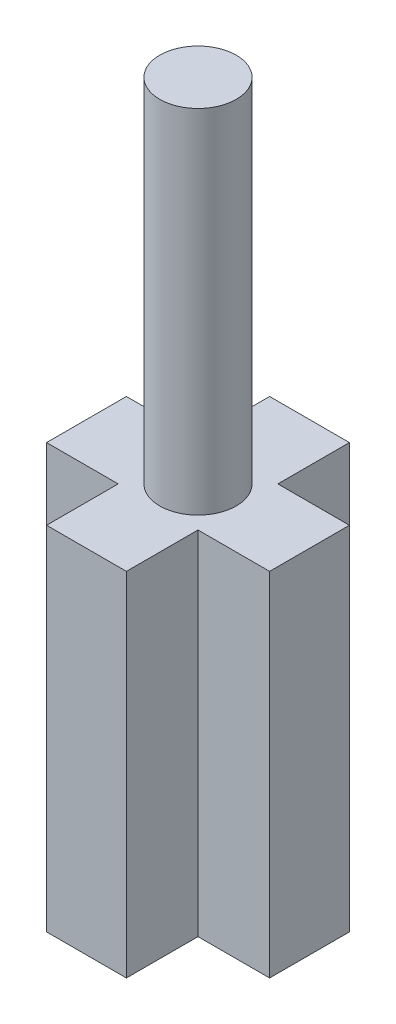
ISO-10303-21;
HEADER;
FILE_DESCRIPTION(('STEP AP214'),'2;1');
FILE_NAME('part.step','',(''),(''),'','','');
FILE_SCHEMA(('AUTOMOTIVE_DESIGN { 1 0 10303 214 1 1 1 1 }'));
ENDSEC;
DATA;
#1=APPLICATION_CONTEXT('core data for automotive mechanical design processes');
#2=APPLICATION_PROTOCOL_DEFINITION('international standard','automotive_design',2000,#1);
#3=PRODUCT_CONTEXT('',#1,'mechanical');
#4=PRODUCT('Part','Part','',(#3));
#5=PRODUCT_RELATED_PRODUCT_CATEGORY('part','',(#4));
#6=PRODUCT_DEFINITION_FORMATION('','',#4);
#7=PRODUCT_DEFINITION_CONTEXT('part definition',#1,'design');
#8=PRODUCT_DEFINITION('design','',#6,#7);
#9=PRODUCT_DEFINITION_SHAPE('','',#8);
#10=(LENGTH_UNIT() NAMED_UNIT(*) SI_UNIT(.MILLI.,.METRE.));
#11=(NAMED_UNIT(*) PLANE_ANGLE_UNIT() SI_UNIT($,.RADIAN.));
#12=(NAMED_UNIT(*) SI_UNIT($,.STERADIAN.) SOLID_ANGLE_UNIT());
#13=UNCERTAINTY_MEASURE_WITH_UNIT(LENGTH_MEASURE(1.E-05),#10,'distance_accuracy_value','');
#14=(GEOMETRIC_REPRESENTATION_CONTEXT(3) GLOBAL_UNCERTAINTY_ASSIGNED_CONTEXT((#13)) GLOBAL_UNIT_ASSIGNED_CONTEXT((#10,
#11,#12)) REPRESENTATION_CONTEXT('',''));
#15=CARTESIAN_POINT('',(0.,0.,0.));
#16=DIRECTION('',(0.,0.,1.));
#17=DIRECTION('',(1.,0.,0.));
#18=AXIS2_PLACEMENT_3D('',#15,#16,#17);
#19=CARTESIAN_POINT('',(0.863599999999994,7.62,0.863599999999999));
#20=DIRECTION('',(-1.,0.,0.));
#21=DIRECTION('',(0.,0.,1.));
#22=AXIS2_PLACEMENT_3D('',#19,#20,#21);
#23=PLANE('',#22);
#24=DIRECTION('',(0.,0.,-1.));
#25=VECTOR('',#24,1.);
#26=CARTESIAN_POINT('',(0.863599999999994,0.,0.863599999999999));
#27=LINE('',#26,#25);
#28=CARTESIAN_POINT('',(0.863599999999985,0.,2.41299999999999));
#29=VERTEX_POINT('',#28);
#30=CARTESIAN_POINT('',(0.863599999999994,0.,0.863599999999999));
#31=VERTEX_POINT('',#30);
#32=EDGE_CURVE('E161',#29,#31,#27,.T.);
#33=ORIENTED_EDGE('',*,*,#32,.T.);
#34=DIRECTION('',(0.,-1.,0.));
#35=VECTOR('',#34,1.);
#36=CARTESIAN_POINT('',(0.863599999999994,7.62,0.863599999999999));
#37=LINE('',#36,#35);
#38=CARTESIAN_POINT('',(0.863599999999994,7.62,0.863599999999999));
#39=VERTEX_POINT('',#38);
#40=EDGE_CURVE('E11',#39,#31,#37,.T.);
#41=ORIENTED_EDGE('',*,*,#40,.F.);
#42=DIRECTION('',(0.,0.,-1.));
#43=VECTOR('',#42,1.);
#44=CARTESIAN_POINT('',(0.863599999999994,7.62,0.863599999999999));
#45=LINE('',#44,#43);
#46=CARTESIAN_POINT('',(0.863599999999985,7.62,2.41299999999999));
#47=VERTEX_POINT('',#46);
#48=EDGE_CURVE('E184',#47,#39,#45,.T.);
#49=ORIENTED_EDGE('',*,*,#48,.F.);
#50=DIRECTION('',(0.,-1.,0.));
#51=VECTOR('',#50,1.);
#52=CARTESIAN_POINT('',(0.863599999999985,7.62,2.41299999999999));
#53=LINE('',#52,#51);
#54=EDGE_CURVE('E157',#47,#29,#53,.T.);
#55=ORIENTED_EDGE('',*,*,#54,.T.);
#56=EDGE_LOOP('',(#33,#41,#49,#55));
#57=FACE_BOUND('',#56,.T.);
#58=ADVANCED_FACE('F41',(#57),#23,.F.);
#59=CARTESIAN_POINT('',(0.863599999999994,7.62,0.863599999999999));
#60=DIRECTION('',(0.,0.,-1.));
#61=DIRECTION('',(-1.,0.,0.));
#62=AXIS2_PLACEMENT_3D('',#59,#60,#61);
#63=PLANE('',#62);
#64=DIRECTION('',(1.,0.,0.));
#65=VECTOR('',#64,1.);
#66=CARTESIAN_POINT('',(0.863599999999994,0.,0.863599999999999));
#67=LINE('',#66,#65);
#68=CARTESIAN_POINT('',(2.41299999999999,0.,0.863599999999998));
#69=VERTEX_POINT('',#68);
#70=EDGE_CURVE('E164',#31,#69,#67,.T.);
#71=ORIENTED_EDGE('',*,*,#70,.T.);
#72=DIRECTION('',(0.,-1.,0.));
#73=VECTOR('',#72,1.);
#74=CARTESIAN_POINT('',(2.41299999999999,7.62,0.863599999999998));
#75=LINE('',#74,#73);
#76=CARTESIAN_POINT('',(2.41299999999999,7.62,0.863599999999998));
#77=VERTEX_POINT('',#76);
#78=EDGE_CURVE('E49',#77,#69,#75,.T.);
#79=ORIENTED_EDGE('',*,*,#78,.F.);
#80=DIRECTION('',(1.,0.,0.));
#81=VECTOR('',#80,1.);
#82=CARTESIAN_POINT('',(0.863599999999994,7.62,0.863599999999999));
#83=LINE('',#82,#81);
#84=EDGE_CURVE('E112',#39,#77,#83,.T.);
#85=ORIENTED_EDGE('',*,*,#84,.F.);
#86=ORIENTED_EDGE('',*,*,#40,.T.);
#87=EDGE_LOOP('',(#71,#79,#85,#86));
#88=FACE_BOUND('',#87,.T.);
#89=ADVANCED_FACE('F263',(#88),#63,.F.);
#90=CARTESIAN_POINT('',(2.41299999999999,7.62,0.863599999999998));
#91=DIRECTION('',(-1.,0.,0.));
#92=DIRECTION('',(0.,0.,1.));
#93=AXIS2_PLACEMENT_3D('',#90,#91,#92);
#94=PLANE('',#93);
#95=DIRECTION('',(0.,0.,-1.));
#96=VECTOR('',#95,1.);
#97=CARTESIAN_POINT('',(2.41299999999999,0.,0.863599999999998));
#98=LINE('',#97,#96);
#99=CARTESIAN_POINT('',(2.41299999999999,0.,-0.863600000000002));
#100=VERTEX_POINT('',#99);
#101=EDGE_CURVE('E167',#69,#100,#98,.T.);
#102=ORIENTED_EDGE('',*,*,#101,.T.);
#103=DIRECTION('',(0.,-1.,0.));
#104=VECTOR('',#103,1.);
#105=CARTESIAN_POINT('',(2.41299999999999,7.62,-0.863600000000002));
#106=LINE('',#105,#104);
#107=CARTESIAN_POINT('',(2.41299999999999,7.62,-0.863600000000002));
#108=VERTEX_POINT('',#107);
#109=EDGE_CURVE('E203',#108,#100,#106,.T.);
#110=ORIENTED_EDGE('',*,*,#109,.F.);
#111=DIRECTION('',(0.,0.,-1.));
#112=VECTOR('',#111,1.);
#113=CARTESIAN_POINT('',(2.41299999999999,7.62,0.863599999999998));
#114=LINE('',#113,#112);
#115=EDGE_CURVE('E211',#77,#108,#114,.T.);
#116=ORIENTED_EDGE('',*,*,#115,.F.);
#117=ORIENTED_EDGE('',*,*,#78,.T.);
#118=EDGE_LOOP('',(#102,#110,#116,#117));
#119=FACE_BOUND('',#118,.T.);
#120=ADVANCED_FACE('F209',(#119),#94,.F.);
#121=CARTESIAN_POINT('',(0.863599999999994,7.62,-0.863600000000001));
#122=DIRECTION('',(0.,0.,1.));
#123=DIRECTION('',(1.,0.,0.));
#124=AXIS2_PLACEMENT_3D('',#121,#122,#123);
#125=PLANE('',#124);
#126=DIRECTION('',(-1.,0.,0.));
#127=VECTOR('',#126,1.);
#128=CARTESIAN_POINT('',(0.863599999999994,0.,-0.863600000000001));
#129=LINE('',#128,#127);
#130=CARTESIAN_POINT('',(0.863599999999994,0.,-0.863600000000001));
#131=VERTEX_POINT('',#130);
#132=EDGE_CURVE('E169',#100,#131,#129,.T.);
#133=ORIENTED_EDGE('',*,*,#132,.T.);
#134=DIRECTION('',(0.,-1.,0.));
#135=VECTOR('',#134,1.);
#136=CARTESIAN_POINT('',(0.863599999999994,7.62,-0.863600000000001));
#137=LINE('',#136,#135);
#138=CARTESIAN_POINT('',(0.863599999999994,7.62,-0.863600000000001));
#139=VERTEX_POINT('',#138);
#140=EDGE_CURVE('E200',#139,#131,#137,.T.);
#141=ORIENTED_EDGE('',*,*,#140,.F.);
#142=DIRECTION('',(-1.,0.,0.));
#143=VECTOR('',#142,1.);
#144=CARTESIAN_POINT('',(0.863599999999994,7.62,-0.863600000000001));
#145=LINE('',#144,#143);
#146=EDGE_CURVE('E229',#108,#139,#145,.T.);
#147=ORIENTED_EDGE('',*,*,#146,.F.);
#148=ORIENTED_EDGE('',*,*,#109,.T.);
#149=EDGE_LOOP('',(#133,#141,#147,#148));
#150=FACE_BOUND('',#149,.T.);
#151=ADVANCED_FACE('F220',(#150),#125,.F.);
#152=CARTESIAN_POINT('',(0.863599999999985,7.62,-2.413));
#153=DIRECTION('',(-1.,0.,0.));
#154=DIRECTION('',(0.,0.,1.));
#155=AXIS2_PLACEMENT_3D('',#152,#153,#154);
#156=PLANE('',#155);
#157=DIRECTION('',(0.,0.,-1.));
#158=VECTOR('',#157,1.);
#159=CARTESIAN_POINT('',(0.863599999999985,0.,-2.413));
#160=LINE('',#159,#158);
#161=CARTESIAN_POINT('',(0.863599999999985,0.,-2.413));
#162=VERTEX_POINT('',#161);
#163=EDGE_CURVE('E171',#131,#162,#160,.T.);
#164=ORIENTED_EDGE('',*,*,#163,.T.);
#165=DIRECTION('',(0.,-1.,0.));
#166=VECTOR('',#165,1.);
#167=CARTESIAN_POINT('',(0.863599999999985,7.62,-2.413));
#168=LINE('',#167,#166);
#169=CARTESIAN_POINT('',(0.863599999999985,7.62,-2.413));
#170=VERTEX_POINT('',#169);
#171=EDGE_CURVE('E197',#170,#162,#168,.T.);
#172=ORIENTED_EDGE('',*,*,#171,.F.);
#173=DIRECTION('',(0.,0.,-1.));
#174=VECTOR('',#173,1.);
#175=CARTESIAN_POINT('',(0.863599999999985,7.62,-2.413));
#176=LINE('',#175,#174);
#177=EDGE_CURVE('E226',#139,#170,#176,.T.);
#178=ORIENTED_EDGE('',*,*,#177,.F.);
#179=ORIENTED_EDGE('',*,*,#140,.T.);
#180=EDGE_LOOP('',(#164,#172,#178,#179));
#181=FACE_BOUND('',#180,.T.);
#182=ADVANCED_FACE('F224',(#181),#156,.F.);
#183=CARTESIAN_POINT('',(-0.863600000000019,7.62,-2.413));
#184=DIRECTION('',(0.,0.,1.));
#185=DIRECTION('',(1.,0.,0.));
#186=AXIS2_PLACEMENT_3D('',#183,#184,#185);
#187=PLANE('',#186);
#188=DIRECTION('',(-1.,0.,0.));
#189=VECTOR('',#188,1.);
#190=CARTESIAN_POINT('',(-0.863600000000019,0.,-2.413));
#191=LINE('',#190,#189);
#192=CARTESIAN_POINT('',(-0.863600000000019,0.,-2.413));
#193=VERTEX_POINT('',#192);
#194=EDGE_CURVE('E173',#162,#193,#191,.T.);
#195=ORIENTED_EDGE('',*,*,#194,.T.);
#196=DIRECTION('',(0.,-1.,0.));
#197=VECTOR('',#196,1.);
#198=CARTESIAN_POINT('',(-0.863600000000019,7.62,-2.413));
#199=LINE('',#198,#197);
#200=CARTESIAN_POINT('',(-0.863600000000019,7.62,-2.413));
#201=VERTEX_POINT('',#200);
#202=EDGE_CURVE('E194',#201,#193,#199,.T.);
#203=ORIENTED_EDGE('',*,*,#202,.F.);
#204=DIRECTION('',(-1.,0.,0.));
#205=VECTOR('',#204,1.);
#206=CARTESIAN_POINT('',(-0.863600000000019,7.62,-2.413));
#207=LINE('',#206,#205);
#208=EDGE_CURVE('E228',#170,#201,#207,.T.);
#209=ORIENTED_EDGE('',*,*,#208,.F.);
#210=ORIENTED_EDGE('',*,*,#171,.T.);
#211=EDGE_LOOP('',(#195,#203,#209,#210));
#212=FACE_BOUND('',#211,.T.);
#213=ADVANCED_FACE('F276',(#212),#187,.F.);
#214=CARTESIAN_POINT('',(-0.863600000000019,7.62,-2.413));
#215=DIRECTION('',(1.,0.,0.));
#216=DIRECTION('',(0.,0.,-1.));
#217=AXIS2_PLACEMENT_3D('',#214,#215,#216);
#218=PLANE('',#217);
#219=DIRECTION('',(0.,0.,1.));
#220=VECTOR('',#219,1.);
#221=CARTESIAN_POINT('',(-0.863600000000019,0.,-2.413));
#222=LINE('',#221,#220);
#223=CARTESIAN_POINT('',(-0.863600000000004,0.,-0.8636));
#224=VERTEX_POINT('',#223);
#225=EDGE_CURVE('E175',#193,#224,#222,.T.);
#226=ORIENTED_EDGE('',*,*,#225,.T.);
#227=DIRECTION('',(0.,-1.,0.));
#228=VECTOR('',#227,1.);
#229=CARTESIAN_POINT('',(-0.863600000000004,7.62,-0.8636));
#230=LINE('',#229,#228);
#231=CARTESIAN_POINT('',(-0.863600000000004,7.62,-0.8636));
#232=VERTEX_POINT('',#231);
#233=EDGE_CURVE('E191',#232,#224,#230,.T.);
#234=ORIENTED_EDGE('',*,*,#233,.F.);
#235=DIRECTION('',(0.,0.,1.));
#236=VECTOR('',#235,1.);
#237=CARTESIAN_POINT('',(-0.863600000000019,7.62,-2.413));
#238=LINE('',#237,#236);
#239=EDGE_CURVE('E231',#201,#232,#238,.T.);
#240=ORIENTED_EDGE('',*,*,#239,.F.);
#241=ORIENTED_EDGE('',*,*,#202,.T.);
#242=EDGE_LOOP('',(#226,#234,#240,#241));
#243=FACE_BOUND('',#242,.T.);
#244=ADVANCED_FACE('F279',(#243),#218,.F.);
#245=CARTESIAN_POINT('',(-2.41300000000001,7.62,-0.863600000000002));
#246=DIRECTION('',(0.,0.,1.));
#247=DIRECTION('',(1.,0.,0.));
#248=AXIS2_PLACEMENT_3D('',#245,#246,#247);
#249=PLANE('',#248);
#250=DIRECTION('',(-1.,0.,0.));
#251=VECTOR('',#250,1.);
#252=CARTESIAN_POINT('',(-2.41300000000001,0.,-0.863600000000002));
#253=LINE('',#252,#251);
#254=CARTESIAN_POINT('',(-2.41300000000001,0.,-0.863600000000002));
#255=VERTEX_POINT('',#254);
#256=EDGE_CURVE('E177',#224,#255,#253,.T.);
#257=ORIENTED_EDGE('',*,*,#256,.T.);
#258=DIRECTION('',(0.,-1.,0.));
#259=VECTOR('',#258,1.);
#260=CARTESIAN_POINT('',(-2.41300000000001,7.62,-0.863600000000002));
#261=LINE('',#260,#259);
#262=CARTESIAN_POINT('',(-2.41300000000001,7.62,-0.863600000000002));
#263=VERTEX_POINT('',#262);
#264=EDGE_CURVE('E188',#263,#255,#261,.T.);
#265=ORIENTED_EDGE('',*,*,#264,.F.);
#266=DIRECTION('',(-1.,0.,0.));
#267=VECTOR('',#266,1.);
#268=CARTESIAN_POINT('',(-2.41300000000001,7.62,-0.863600000000002));
#269=LINE('',#268,#267);
#270=EDGE_CURVE('E237',#232,#263,#269,.T.);
#271=ORIENTED_EDGE('',*,*,#270,.F.);
#272=ORIENTED_EDGE('',*,*,#233,.T.);
#273=EDGE_LOOP('',(#257,#265,#271,#272));
#274=FACE_BOUND('',#273,.T.);
#275=ADVANCED_FACE('F243',(#274),#249,.F.);
#276=CARTESIAN_POINT('',(-2.41300000000001,7.62,0.863599999999998));
#277=DIRECTION('',(1.,0.,0.));
#278=DIRECTION('',(0.,0.,-1.));
#279=AXIS2_PLACEMENT_3D('',#276,#277,#278);
#280=PLANE('',#279);
#281=DIRECTION('',(0.,0.,1.));
#282=VECTOR('',#281,1.);
#283=CARTESIAN_POINT('',(-2.41300000000001,0.,0.863599999999998));
#284=LINE('',#283,#282);
#285=CARTESIAN_POINT('',(-2.41300000000001,0.,0.863599999999998));
#286=VERTEX_POINT('',#285);
#287=EDGE_CURVE('E179',#255,#286,#284,.T.);
#288=ORIENTED_EDGE('',*,*,#287,.T.);
#289=DIRECTION('',(0.,-1.,0.));
#290=VECTOR('',#289,1.);
#291=CARTESIAN_POINT('',(-2.41300000000001,7.62,0.863599999999998));
#292=LINE('',#291,#290);
#293=CARTESIAN_POINT('',(-2.41300000000001,7.62,0.863599999999998));
#294=VERTEX_POINT('',#293);
#295=EDGE_CURVE('E152',#294,#286,#292,.T.);
#296=ORIENTED_EDGE('',*,*,#295,.F.);
#297=DIRECTION('',(0.,0.,1.));
#298=VECTOR('',#297,1.);
#299=CARTESIAN_POINT('',(-2.41300000000001,7.62,0.863599999999998));
#300=LINE('',#299,#298);
#301=EDGE_CURVE('E143',#263,#294,#300,.T.);
#302=ORIENTED_EDGE('',*,*,#301,.F.);
#303=ORIENTED_EDGE('',*,*,#264,.T.);
#304=EDGE_LOOP('',(#288,#296,#302,#303));
#305=FACE_BOUND('',#304,.T.);
#306=ADVANCED_FACE('F247',(#305),#280,.F.);
#307=CARTESIAN_POINT('',(-2.41300000000001,7.62,0.863599999999998));
#308=DIRECTION('',(0.,0.,-1.));
#309=DIRECTION('',(-1.,0.,0.));
#310=AXIS2_PLACEMENT_3D('',#307,#308,#309);
#311=PLANE('',#310);
#312=DIRECTION('',(1.,0.,0.));
#313=VECTOR('',#312,1.);
#314=CARTESIAN_POINT('',(-2.41300000000001,0.,0.863599999999998));
#315=LINE('',#314,#313);
#316=CARTESIAN_POINT('',(-0.863600000000004,0.,0.8636));
#317=VERTEX_POINT('',#316);
#318=EDGE_CURVE('E151',#286,#317,#315,.T.);
#319=ORIENTED_EDGE('',*,*,#318,.T.);
#320=DIRECTION('',(0.,-1.,0.));
#321=VECTOR('',#320,1.);
#322=CARTESIAN_POINT('',(-0.863600000000004,7.62,0.8636));
#323=LINE('',#322,#321);
#324=CARTESIAN_POINT('',(-0.863600000000004,7.62,0.8636));
#325=VERTEX_POINT('',#324);
#326=EDGE_CURVE('E148',#325,#317,#323,.T.);
#327=ORIENTED_EDGE('',*,*,#326,.F.);
#328=DIRECTION('',(1.,0.,0.));
#329=VECTOR('',#328,1.);
#330=CARTESIAN_POINT('',(-2.41300000000001,7.62,0.863599999999998));
#331=LINE('',#330,#329);
#332=EDGE_CURVE('E137',#294,#325,#331,.T.);
#333=ORIENTED_EDGE('',*,*,#332,.F.);
#334=ORIENTED_EDGE('',*,*,#295,.T.);
#335=EDGE_LOOP('',(#319,#327,#333,#334));
#336=FACE_BOUND('',#335,.T.);
#337=ADVANCED_FACE('F149',(#336),#311,.F.);
#338=CARTESIAN_POINT('',(-0.863600000000004,7.62,0.8636));
#339=DIRECTION('',(1.,0.,0.));
#340=DIRECTION('',(0.,0.,-1.));
#341=AXIS2_PLACEMENT_3D('',#338,#339,#340);
#342=PLANE('',#341);
#343=DIRECTION('',(0.,0.,1.));
#344=VECTOR('',#343,1.);
#345=CARTESIAN_POINT('',(-0.863600000000004,0.,0.8636));
#346=LINE('',#345,#344);
#347=CARTESIAN_POINT('',(-0.863600000000019,0.,2.41299999999999));
#348=VERTEX_POINT('',#347);
#349=EDGE_CURVE('E98',#317,#348,#346,.T.);
#350=ORIENTED_EDGE('',*,*,#349,.T.);
#351=DIRECTION('',(0.,-1.,0.));
#352=VECTOR('',#351,1.);
#353=CARTESIAN_POINT('',(-0.863600000000019,7.62,2.41299999999999));
#354=LINE('',#353,#352);
#355=CARTESIAN_POINT('',(-0.863600000000019,7.62,2.41299999999999));
#356=VERTEX_POINT('',#355);
#357=EDGE_CURVE('E153',#356,#348,#354,.T.);
#358=ORIENTED_EDGE('',*,*,#357,.F.);
#359=DIRECTION('',(0.,0.,1.));
#360=VECTOR('',#359,1.);
#361=CARTESIAN_POINT('',(-0.863600000000004,7.62,0.8636));
#362=LINE('',#361,#360);
#363=EDGE_CURVE('E141',#325,#356,#362,.T.);
#364=ORIENTED_EDGE('',*,*,#363,.F.);
#365=ORIENTED_EDGE('',*,*,#326,.T.);
#366=EDGE_LOOP('',(#350,#358,#364,#365));
#367=FACE_BOUND('',#366,.T.);
#368=ADVANCED_FACE('F155',(#367),#342,.F.);
#369=CARTESIAN_POINT('',(-0.863600000000019,7.62,2.41299999999999));
#370=DIRECTION('',(0.,0.,-1.));
#371=DIRECTION('',(-1.,0.,0.));
#372=AXIS2_PLACEMENT_3D('',#369,#370,#371);
#373=PLANE('',#372);
#374=DIRECTION('',(1.,0.,0.));
#375=VECTOR('',#374,1.);
#376=CARTESIAN_POINT('',(-0.863600000000019,0.,2.41299999999999));
#377=LINE('',#376,#375);
#378=EDGE_CURVE('E104',#348,#29,#377,.T.);
#379=ORIENTED_EDGE('',*,*,#378,.T.);
#380=ORIENTED_EDGE('',*,*,#54,.F.);
#381=DIRECTION('',(1.,0.,0.));
#382=VECTOR('',#381,1.);
#383=CARTESIAN_POINT('',(-0.863600000000019,7.62,2.41299999999999));
#384=LINE('',#383,#382);
#385=EDGE_CURVE('E57',#356,#47,#384,.T.);
#386=ORIENTED_EDGE('',*,*,#385,.F.);
#387=ORIENTED_EDGE('',*,*,#357,.T.);
#388=EDGE_LOOP('',(#379,#380,#386,#387));
#389=FACE_BOUND('',#388,.T.);
#390=ADVANCED_FACE('F251',(#389),#373,.F.);
#391=CARTESIAN_POINT('',(0.,7.62,0.));
#392=DIRECTION('',(0.,1.,0.));
#393=DIRECTION('',(0.,0.,1.));
#394=AXIS2_PLACEMENT_3D('',#391,#392,#393);
#395=PLANE('',#394);
#396=CARTESIAN_POINT('',(0.,7.62,0.));
#397=DIRECTION('',(0.,1.,0.));
#398=DIRECTION('',(0.,0.,1.));
#399=AXIS2_PLACEMENT_3D('',#396,#397,#398);
#400=CIRCLE('',#399,0.82804);
#401=CARTESIAN_POINT('',(0.,7.62,0.82804));
#402=VERTEX_POINT('',#401);
#403=EDGE_CURVE('E340',#402,#402,#400,.T.);
#404=ORIENTED_EDGE('',*,*,#403,.F.);
#405=EDGE_LOOP('',(#404));
#406=FACE_BOUND('',#405,.T.);
#407=ORIENTED_EDGE('',*,*,#48,.T.);
#408=ORIENTED_EDGE('',*,*,#84,.T.);
#409=ORIENTED_EDGE('',*,*,#115,.T.);
#410=ORIENTED_EDGE('',*,*,#146,.T.);
#411=ORIENTED_EDGE('',*,*,#177,.T.);
#412=ORIENTED_EDGE('',*,*,#208,.T.);
#413=ORIENTED_EDGE('',*,*,#239,.T.);
#414=ORIENTED_EDGE('',*,*,#270,.T.);
#415=ORIENTED_EDGE('',*,*,#301,.T.);
#416=ORIENTED_EDGE('',*,*,#332,.T.);
#417=ORIENTED_EDGE('',*,*,#363,.T.);
#418=ORIENTED_EDGE('',*,*,#385,.T.);
#419=EDGE_LOOP('',(#407,#408,#409,#410,#411,#412,#413,#414,#415,#416,#417,#418));
#420=FACE_BOUND('',#419,.T.);
#421=ADVANCED_FACE('F139',(#406,#420),#395,.T.);
#422=CARTESIAN_POINT('',(0.,0.,0.));
#423=DIRECTION('',(0.,1.,0.));
#424=DIRECTION('',(0.,0.,1.));
#425=AXIS2_PLACEMENT_3D('',#422,#423,#424);
#426=PLANE('',#425);
#427=ORIENTED_EDGE('',*,*,#32,.F.);
#428=ORIENTED_EDGE('',*,*,#378,.F.);
#429=ORIENTED_EDGE('',*,*,#349,.F.);
#430=ORIENTED_EDGE('',*,*,#318,.F.);
#431=ORIENTED_EDGE('',*,*,#287,.F.);
#432=ORIENTED_EDGE('',*,*,#256,.F.);
#433=ORIENTED_EDGE('',*,*,#225,.F.);
#434=ORIENTED_EDGE('',*,*,#194,.F.);
#435=ORIENTED_EDGE('',*,*,#163,.F.);
#436=ORIENTED_EDGE('',*,*,#132,.F.);
#437=ORIENTED_EDGE('',*,*,#101,.F.);
#438=ORIENTED_EDGE('',*,*,#70,.F.);
#439=EDGE_LOOP('',(#427,#428,#429,#430,#431,#432,#433,#434,#435,#436,#437,#438));
#440=FACE_BOUND('',#439,.T.);
#441=ADVANCED_FACE('F215',(#440),#426,.F.);
#442=CARTESIAN_POINT('',(0.,15.24,0.));
#443=DIRECTION('',(0.,-1.,0.));
#444=DIRECTION('',(0.,0.,-1.));
#445=AXIS2_PLACEMENT_3D('',#442,#443,#444);
#446=CYLINDRICAL_SURFACE('',#445,0.82804);
#447=CARTESIAN_POINT('',(0.,15.24,0.));
#448=DIRECTION('',(0.,1.,0.));
#449=DIRECTION('',(0.,0.,1.));
#450=AXIS2_PLACEMENT_3D('',#447,#448,#449);
#451=CIRCLE('',#450,0.82804);
#452=CARTESIAN_POINT('',(0.,15.24,0.82804));
#453=VERTEX_POINT('',#452);
#454=EDGE_CURVE('E165',#453,#453,#451,.T.);
#455=ORIENTED_EDGE('',*,*,#454,.F.);
#456=EDGE_LOOP('',(#455));
#457=FACE_BOUND('',#456,.T.);
#458=ORIENTED_EDGE('',*,*,#403,.T.);
#459=EDGE_LOOP('',(#458));
#460=FACE_BOUND('',#459,.T.);
#461=ADVANCED_FACE('F311',(#457,#460),#446,.T.);
#462=CARTESIAN_POINT('',(0.,15.24,0.));
#463=DIRECTION('',(0.,1.,0.));
#464=DIRECTION('',(0.,0.,1.));
#465=AXIS2_PLACEMENT_3D('',#462,#463,#464);
#466=PLANE('',#465);
#467=ORIENTED_EDGE('',*,*,#454,.T.);
#468=EDGE_LOOP('',(#467));
#469=FACE_BOUND('',#468,.T.);
#470=ADVANCED_FACE('F324',(#469),#466,.T.);
#471=CLOSED_SHELL('',(#58,#89,#120,#151,#182,#213,#244,#275,#306,#337,#368,#390,#421,#441,#461,#470));
#472=MANIFOLD_SOLID_BREP('B2',#471);
#473=ADVANCED_BREP_SHAPE_REPRESENTATION('',(#18,#472),#14);
#474=SHAPE_DEFINITION_REPRESENTATION(#9,#473);
ENDSEC;
END-ISO-10303-21;
